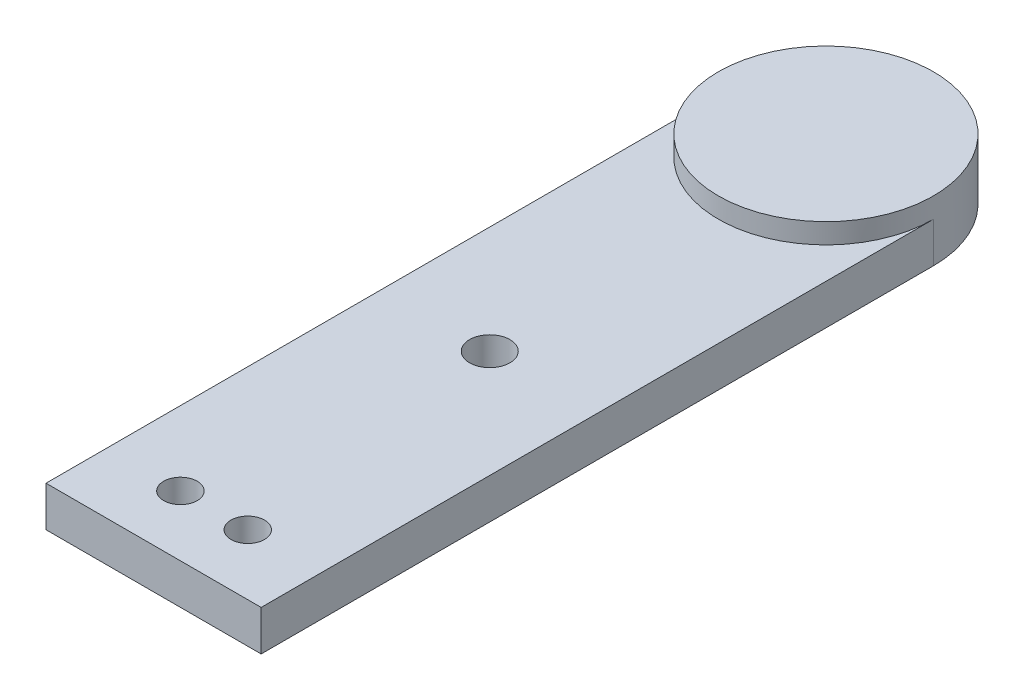
ISO-10303-21;
HEADER;
FILE_DESCRIPTION(('STEP AP214'),'2;1');
FILE_NAME('part.step','',(''),(''),'','','');
FILE_SCHEMA(('AUTOMOTIVE_DESIGN { 1 0 10303 214 1 1 1 1 }'));
ENDSEC;
DATA;
#1=APPLICATION_CONTEXT('core data for automotive mechanical design processes');
#2=APPLICATION_PROTOCOL_DEFINITION('international standard','automotive_design',2000,#1);
#3=PRODUCT_CONTEXT('',#1,'mechanical');
#4=PRODUCT('Part','Part','',(#3));
#5=PRODUCT_RELATED_PRODUCT_CATEGORY('part','',(#4));
#6=PRODUCT_DEFINITION_FORMATION('','',#4);
#7=PRODUCT_DEFINITION_CONTEXT('part definition',#1,'design');
#8=PRODUCT_DEFINITION('design','',#6,#7);
#9=PRODUCT_DEFINITION_SHAPE('','',#8);
#10=(LENGTH_UNIT() NAMED_UNIT(*) SI_UNIT(.MILLI.,.METRE.));
#11=(NAMED_UNIT(*) PLANE_ANGLE_UNIT() SI_UNIT($,.RADIAN.));
#12=(NAMED_UNIT(*) SI_UNIT($,.STERADIAN.) SOLID_ANGLE_UNIT());
#13=UNCERTAINTY_MEASURE_WITH_UNIT(LENGTH_MEASURE(1.E-05),#10,'distance_accuracy_value','');
#14=(GEOMETRIC_REPRESENTATION_CONTEXT(3) GLOBAL_UNCERTAINTY_ASSIGNED_CONTEXT((#13)) GLOBAL_UNIT_ASSIGNED_CONTEXT((#10,
#11,#12)) REPRESENTATION_CONTEXT('',''));
#15=CARTESIAN_POINT('',(0.,0.,0.));
#16=DIRECTION('',(0.,0.,1.));
#17=DIRECTION('',(1.,0.,0.));
#18=AXIS2_PLACEMENT_3D('',#15,#16,#17);
#19=CARTESIAN_POINT('',(0.,3.,0.));
#20=DIRECTION('',(0.,-1.,0.));
#21=DIRECTION('',(0.,0.,-1.));
#22=AXIS2_PLACEMENT_3D('',#19,#20,#21);
#23=CYLINDRICAL_SURFACE('',#22,8.);
#24=CARTESIAN_POINT('',(0.,3.,0.));
#25=DIRECTION('',(0.,1.,0.));
#26=DIRECTION('',(0.,0.,1.));
#27=AXIS2_PLACEMENT_3D('',#24,#25,#26);
#28=CIRCLE('',#27,8.);
#29=CARTESIAN_POINT('',(0.,3.,8.));
#30=VERTEX_POINT('',#29);
#31=EDGE_CURVE('E45',#30,#30,#28,.T.);
#32=ORIENTED_EDGE('',*,*,#31,.F.);
#33=EDGE_LOOP('',(#32));
#34=FACE_BOUND('',#33,.T.);
#35=DIRECTION('',(0.,-1.,0.));
#36=VECTOR('',#35,1.);
#37=CARTESIAN_POINT('',(-8.,1.5,0.));
#38=LINE('',#37,#36);
#39=CARTESIAN_POINT('',(-8.,1.5,0.));
#40=VERTEX_POINT('',#39);
#41=CARTESIAN_POINT('',(-8.,-1.5,0.));
#42=VERTEX_POINT('',#41);
#43=EDGE_CURVE('E55',#40,#42,#38,.T.);
#44=ORIENTED_EDGE('',*,*,#43,.F.);
#45=CARTESIAN_POINT('',(0.,1.5,0.));
#46=DIRECTION('',(0.,1.,0.));
#47=DIRECTION('',(0.,0.,1.));
#48=AXIS2_PLACEMENT_3D('',#45,#46,#47);
#49=CIRCLE('',#48,8.);
#50=CARTESIAN_POINT('',(8.,1.5,0.));
#51=VERTEX_POINT('',#50);
#52=EDGE_CURVE('E11',#40,#51,#49,.T.);
#53=ORIENTED_EDGE('',*,*,#52,.T.);
#54=DIRECTION('',(0.,-1.,0.));
#55=VECTOR('',#54,1.);
#56=CARTESIAN_POINT('',(8.,1.5,0.));
#57=LINE('',#56,#55);
#58=CARTESIAN_POINT('',(8.,-1.5,0.));
#59=VERTEX_POINT('',#58);
#60=EDGE_CURVE('E99',#51,#59,#57,.T.);
#61=ORIENTED_EDGE('',*,*,#60,.T.);
#62=CARTESIAN_POINT('',(0.,-1.5,0.));
#63=DIRECTION('',(0.,1.,0.));
#64=DIRECTION('',(0.,0.,1.));
#65=AXIS2_PLACEMENT_3D('',#62,#63,#64);
#66=CIRCLE('',#65,8.);
#67=EDGE_CURVE('E96',#59,#42,#66,.T.);
#68=ORIENTED_EDGE('',*,*,#67,.T.);
#69=EDGE_LOOP('',(#44,#53,#61,#68));
#70=FACE_BOUND('',#69,.T.);
#71=ADVANCED_FACE('F37',(#34,#70),#23,.T.);
#72=CARTESIAN_POINT('',(0.,3.,0.));
#73=DIRECTION('',(0.,1.,0.));
#74=DIRECTION('',(0.,0.,1.));
#75=AXIS2_PLACEMENT_3D('',#72,#73,#74);
#76=PLANE('',#75);
#77=ORIENTED_EDGE('',*,*,#31,.T.);
#78=EDGE_LOOP('',(#77));
#79=FACE_BOUND('',#78,.T.);
#80=ADVANCED_FACE('F106',(#79),#76,.T.);
#81=CARTESIAN_POINT('',(0.,-1.5,0.));
#82=DIRECTION('',(0.,1.,0.));
#83=DIRECTION('',(0.,0.,1.));
#84=AXIS2_PLACEMENT_3D('',#81,#82,#83);
#85=PLANE('',#84);
#86=CARTESIAN_POINT('',(0.,-1.5,25.));
#87=DIRECTION('',(0.,1.,0.));
#88=DIRECTION('',(0.,0.,1.));
#89=AXIS2_PLACEMENT_3D('',#86,#87,#88);
#90=CIRCLE('',#89,1.5);
#91=CARTESIAN_POINT('',(0.,-1.5,26.5));
#92=VERTEX_POINT('',#91);
#93=EDGE_CURVE('E153',#92,#92,#90,.F.);
#94=ORIENTED_EDGE('',*,*,#93,.F.);
#95=EDGE_LOOP('',(#94));
#96=FACE_BOUND('',#95,.T.);
#97=CARTESIAN_POINT('',(0.,-1.5,0.));
#98=DIRECTION('',(0.,1.,0.));
#99=DIRECTION('',(0.,0.,1.));
#100=AXIS2_PLACEMENT_3D('',#97,#98,#99);
#101=CIRCLE('',#100,3.3);
#102=CARTESIAN_POINT('',(0.,-1.5,3.3));
#103=VERTEX_POINT('',#102);
#104=EDGE_CURVE('E40',#103,#103,#101,.T.);
#105=ORIENTED_EDGE('',*,*,#104,.T.);
#106=EDGE_LOOP('',(#105));
#107=FACE_BOUND('',#106,.T.);
#108=CARTESIAN_POINT('',(-2.50307341777024,-1.5,45.5));
#109=DIRECTION('',(0.,-1.,0.));
#110=DIRECTION('',(0.,0.,-1.));
#111=AXIS2_PLACEMENT_3D('',#108,#109,#110);
#112=CIRCLE('',#111,1.25);
#113=CARTESIAN_POINT('',(-2.50307341777024,-1.5,44.25));
#114=VERTEX_POINT('',#113);
#115=EDGE_CURVE('E159',#114,#114,#112,.T.);
#116=ORIENTED_EDGE('',*,*,#115,.F.);
#117=EDGE_LOOP('',(#116));
#118=FACE_BOUND('',#117,.T.);
#119=CARTESIAN_POINT('',(2.50307341776999,-1.5,45.5));
#120=DIRECTION('',(0.,-1.,0.));
#121=DIRECTION('',(0.,0.,-1.));
#122=AXIS2_PLACEMENT_3D('',#119,#120,#121);
#123=CIRCLE('',#122,1.25);
#124=CARTESIAN_POINT('',(2.50307341776999,-1.5,44.25));
#125=VERTEX_POINT('',#124);
#126=EDGE_CURVE('E156',#125,#125,#123,.T.);
#127=ORIENTED_EDGE('',*,*,#126,.F.);
#128=EDGE_LOOP('',(#127));
#129=FACE_BOUND('',#128,.T.);
#130=ORIENTED_EDGE('',*,*,#67,.F.);
#131=DIRECTION('',(0.,0.,-1.));
#132=VECTOR('',#131,1.);
#133=CARTESIAN_POINT('',(8.,-1.5,0.));
#134=LINE('',#133,#132);
#135=CARTESIAN_POINT('',(8.00000000000001,-1.5,50.));
#136=VERTEX_POINT('',#135);
#137=EDGE_CURVE('E91',#136,#59,#134,.T.);
#138=ORIENTED_EDGE('',*,*,#137,.F.);
#139=DIRECTION('',(1.,0.,0.));
#140=VECTOR('',#139,1.);
#141=CARTESIAN_POINT('',(-8.00000000000001,-1.5,50.));
#142=LINE('',#141,#140);
#143=CARTESIAN_POINT('',(-8.00000000000001,-1.5,50.));
#144=VERTEX_POINT('',#143);
#145=EDGE_CURVE('E172',#144,#136,#142,.T.);
#146=ORIENTED_EDGE('',*,*,#145,.F.);
#147=DIRECTION('',(0.,0.,1.));
#148=VECTOR('',#147,1.);
#149=CARTESIAN_POINT('',(-8.,-1.5,0.));
#150=LINE('',#149,#148);
#151=EDGE_CURVE('E95',#42,#144,#150,.T.);
#152=ORIENTED_EDGE('',*,*,#151,.F.);
#153=EDGE_LOOP('',(#130,#138,#146,#152));
#154=FACE_BOUND('',#153,.T.);
#155=ADVANCED_FACE('F112',(#96,#107,#118,#129,#154),#85,.F.);
#156=CARTESIAN_POINT('',(-8.,1.5,0.));
#157=DIRECTION('',(1.,0.,0.));
#158=DIRECTION('',(0.,0.,-1.));
#159=AXIS2_PLACEMENT_3D('',#156,#157,#158);
#160=PLANE('',#159);
#161=ORIENTED_EDGE('',*,*,#151,.T.);
#162=DIRECTION('',(0.,-1.,0.));
#163=VECTOR('',#162,1.);
#164=CARTESIAN_POINT('',(-8.00000000000001,1.5,50.));
#165=LINE('',#164,#163);
#166=CARTESIAN_POINT('',(-8.00000000000001,1.5,50.));
#167=VERTEX_POINT('',#166);
#168=EDGE_CURVE('E79',#167,#144,#165,.T.);
#169=ORIENTED_EDGE('',*,*,#168,.F.);
#170=DIRECTION('',(0.,0.,1.));
#171=VECTOR('',#170,1.);
#172=CARTESIAN_POINT('',(-8.,1.5,0.));
#173=LINE('',#172,#171);
#174=EDGE_CURVE('E86',#40,#167,#173,.T.);
#175=ORIENTED_EDGE('',*,*,#174,.F.);
#176=ORIENTED_EDGE('',*,*,#43,.T.);
#177=EDGE_LOOP('',(#161,#169,#175,#176));
#178=FACE_BOUND('',#177,.T.);
#179=ADVANCED_FACE('F93',(#178),#160,.F.);
#180=CARTESIAN_POINT('',(-8.00000000000001,1.5,50.));
#181=DIRECTION('',(0.,0.,-1.));
#182=DIRECTION('',(-1.,0.,0.));
#183=AXIS2_PLACEMENT_3D('',#180,#181,#182);
#184=PLANE('',#183);
#185=ORIENTED_EDGE('',*,*,#145,.T.);
#186=DIRECTION('',(0.,-1.,0.));
#187=VECTOR('',#186,1.);
#188=CARTESIAN_POINT('',(8.00000000000001,1.5,50.));
#189=LINE('',#188,#187);
#190=CARTESIAN_POINT('',(8.00000000000001,1.5,50.));
#191=VERTEX_POINT('',#190);
#192=EDGE_CURVE('E82',#191,#136,#189,.T.);
#193=ORIENTED_EDGE('',*,*,#192,.F.);
#194=DIRECTION('',(1.,0.,0.));
#195=VECTOR('',#194,1.);
#196=CARTESIAN_POINT('',(-8.00000000000001,1.5,50.));
#197=LINE('',#196,#195);
#198=EDGE_CURVE('E75',#167,#191,#197,.T.);
#199=ORIENTED_EDGE('',*,*,#198,.F.);
#200=ORIENTED_EDGE('',*,*,#168,.T.);
#201=EDGE_LOOP('',(#185,#193,#199,#200));
#202=FACE_BOUND('',#201,.T.);
#203=ADVANCED_FACE('F77',(#202),#184,.F.);
#204=CARTESIAN_POINT('',(8.,1.5,0.));
#205=DIRECTION('',(-1.,0.,0.));
#206=DIRECTION('',(0.,0.,1.));
#207=AXIS2_PLACEMENT_3D('',#204,#205,#206);
#208=PLANE('',#207);
#209=ORIENTED_EDGE('',*,*,#137,.T.);
#210=ORIENTED_EDGE('',*,*,#60,.F.);
#211=DIRECTION('',(0.,0.,-1.));
#212=VECTOR('',#211,1.);
#213=CARTESIAN_POINT('',(8.,1.5,0.));
#214=LINE('',#213,#212);
#215=EDGE_CURVE('E85',#191,#51,#214,.T.);
#216=ORIENTED_EDGE('',*,*,#215,.F.);
#217=ORIENTED_EDGE('',*,*,#192,.T.);
#218=EDGE_LOOP('',(#209,#210,#216,#217));
#219=FACE_BOUND('',#218,.T.);
#220=ADVANCED_FACE('F123',(#219),#208,.F.);
#221=CARTESIAN_POINT('',(0.,1.5,0.));
#222=DIRECTION('',(0.,1.,0.));
#223=DIRECTION('',(0.,0.,1.));
#224=AXIS2_PLACEMENT_3D('',#221,#222,#223);
#225=PLANE('',#224);
#226=CARTESIAN_POINT('',(0.,1.5,25.));
#227=DIRECTION('',(0.,1.,0.));
#228=DIRECTION('',(0.,0.,1.));
#229=AXIS2_PLACEMENT_3D('',#226,#227,#228);
#230=CIRCLE('',#229,1.5);
#231=CARTESIAN_POINT('',(0.,1.5,26.5));
#232=VERTEX_POINT('',#231);
#233=EDGE_CURVE('E150',#232,#232,#230,.T.);
#234=ORIENTED_EDGE('',*,*,#233,.F.);
#235=EDGE_LOOP('',(#234));
#236=FACE_BOUND('',#235,.T.);
#237=CARTESIAN_POINT('',(-2.50307341777024,1.5,45.5));
#238=DIRECTION('',(0.,1.,0.));
#239=DIRECTION('',(0.,0.,1.));
#240=AXIS2_PLACEMENT_3D('',#237,#238,#239);
#241=CIRCLE('',#240,1.25);
#242=CARTESIAN_POINT('',(-2.50307341777024,1.5,46.75));
#243=VERTEX_POINT('',#242);
#244=EDGE_CURVE('E162',#243,#243,#241,.F.);
#245=ORIENTED_EDGE('',*,*,#244,.T.);
#246=EDGE_LOOP('',(#245));
#247=FACE_BOUND('',#246,.T.);
#248=CARTESIAN_POINT('',(2.50307341776999,1.5,45.5));
#249=DIRECTION('',(0.,1.,0.));
#250=DIRECTION('',(0.,0.,1.));
#251=AXIS2_PLACEMENT_3D('',#248,#249,#250);
#252=CIRCLE('',#251,1.25);
#253=CARTESIAN_POINT('',(2.50307341776999,1.5,46.75));
#254=VERTEX_POINT('',#253);
#255=EDGE_CURVE('E165',#254,#254,#252,.F.);
#256=ORIENTED_EDGE('',*,*,#255,.T.);
#257=EDGE_LOOP('',(#256));
#258=FACE_BOUND('',#257,.T.);
#259=ORIENTED_EDGE('',*,*,#52,.F.);
#260=ORIENTED_EDGE('',*,*,#174,.T.);
#261=ORIENTED_EDGE('',*,*,#198,.T.);
#262=ORIENTED_EDGE('',*,*,#215,.T.);
#263=EDGE_LOOP('',(#259,#260,#261,#262));
#264=FACE_BOUND('',#263,.T.);
#265=ADVANCED_FACE('F89',(#236,#247,#258,#264),#225,.T.);
#266=CARTESIAN_POINT('',(2.50307341776999,3.001,45.5));
#267=DIRECTION('',(0.,-1.,0.));
#268=DIRECTION('',(0.,0.,-1.));
#269=AXIS2_PLACEMENT_3D('',#266,#267,#268);
#270=CYLINDRICAL_SURFACE('',#269,1.25);
#271=ORIENTED_EDGE('',*,*,#255,.F.);
#272=EDGE_LOOP('',(#271));
#273=FACE_BOUND('',#272,.T.);
#274=ORIENTED_EDGE('',*,*,#126,.T.);
#275=EDGE_LOOP('',(#274));
#276=FACE_BOUND('',#275,.T.);
#277=ADVANCED_FACE('F129',(#273,#276),#270,.F.);
#278=CARTESIAN_POINT('',(-2.50307341777024,3.001,45.5));
#279=DIRECTION('',(0.,-1.,0.));
#280=DIRECTION('',(0.,0.,-1.));
#281=AXIS2_PLACEMENT_3D('',#278,#279,#280);
#282=CYLINDRICAL_SURFACE('',#281,1.25);
#283=ORIENTED_EDGE('',*,*,#244,.F.);
#284=EDGE_LOOP('',(#283));
#285=FACE_BOUND('',#284,.T.);
#286=ORIENTED_EDGE('',*,*,#115,.T.);
#287=EDGE_LOOP('',(#286));
#288=FACE_BOUND('',#287,.T.);
#289=ADVANCED_FACE('F133',(#285,#288),#282,.F.);
#290=CARTESIAN_POINT('',(0.,-1.5,0.));
#291=DIRECTION('',(1.,0.,0.));
#292=DIRECTION('',(0.,0.,-1.));
#293=AXIS2_PLACEMENT_3D('',#290,#291,#292);
#294=SPHERICAL_SURFACE('',#293,3.3);
#295=CARTESIAN_POINT('',(0.,-1.5,0.));
#296=DIRECTION('',(0.,1.,0.));
#297=DIRECTION('',(0.,0.,1.));
#298=AXIS2_PLACEMENT_3D('',#295,#296,#297);
#299=SPHERICAL_SURFACE('',#298,3.3);
#300=ORIENTED_EDGE('',*,*,#104,.F.);
#301=EDGE_LOOP('',(#300));
#302=FACE_BOUND('',#301,.T.);
#303=ADVANCED_FACE('F137',(#302),#299,.F.);
#304=CARTESIAN_POINT('',(0.,-1.501,25.));
#305=DIRECTION('',(0.,1.,0.));
#306=DIRECTION('',(0.,0.,1.));
#307=AXIS2_PLACEMENT_3D('',#304,#305,#306);
#308=CYLINDRICAL_SURFACE('',#307,1.5);
#309=CARTESIAN_POINT('',(0.,1.5,26.5));
#310=CARTESIAN_POINT('',(0.,1.46875,26.5));
#311=CARTESIAN_POINT('',(0.,1.4375,26.5));
#312=CARTESIAN_POINT('',(0.,1.375,26.5));
#313=CARTESIAN_POINT('',(0.,1.34375,26.5));
#314=CARTESIAN_POINT('',(0.,1.28125,26.5));
#315=CARTESIAN_POINT('',(0.,1.25,26.5));
#316=CARTESIAN_POINT('',(0.,1.1875,26.5));
#317=CARTESIAN_POINT('',(0.,1.15625,26.5));
#318=CARTESIAN_POINT('',(0.,1.09375,26.5));
#319=CARTESIAN_POINT('',(0.,1.0625,26.5));
#320=CARTESIAN_POINT('',(0.,1.,26.5));
#321=CARTESIAN_POINT('',(0.,0.96875,26.5));
#322=CARTESIAN_POINT('',(0.,0.90625,26.5));
#323=CARTESIAN_POINT('',(0.,0.874999999999999,26.5));
#324=CARTESIAN_POINT('',(0.,0.8125,26.5));
#325=CARTESIAN_POINT('',(0.,0.78125,26.5));
#326=CARTESIAN_POINT('',(0.,0.71875,26.5));
#327=CARTESIAN_POINT('',(0.,0.6875,26.5));
#328=CARTESIAN_POINT('',(0.,0.625,26.5));
#329=CARTESIAN_POINT('',(0.,0.59375,26.5));
#330=CARTESIAN_POINT('',(0.,0.53125,26.5));
#331=CARTESIAN_POINT('',(0.,0.5,26.5));
#332=CARTESIAN_POINT('',(0.,0.4375,26.5));
#333=CARTESIAN_POINT('',(0.,0.40625,26.5));
#334=CARTESIAN_POINT('',(0.,0.34375,26.5));
#335=CARTESIAN_POINT('',(0.,0.3125,26.5));
#336=CARTESIAN_POINT('',(0.,0.25,26.5));
#337=CARTESIAN_POINT('',(0.,0.21875,26.5));
#338=CARTESIAN_POINT('',(0.,0.15625,26.5));
#339=CARTESIAN_POINT('',(0.,0.125,26.5));
#340=CARTESIAN_POINT('',(0.,0.0624999999999998,26.5));
#341=CARTESIAN_POINT('',(0.,0.0312499999999998,26.5));
#342=CARTESIAN_POINT('',(0.,-0.0312500000000002,26.5));
#343=CARTESIAN_POINT('',(0.,-0.0625000000000003,26.5));
#344=CARTESIAN_POINT('',(0.,-0.125,26.5));
#345=CARTESIAN_POINT('',(0.,-0.15625,26.5));
#346=CARTESIAN_POINT('',(0.,-0.21875,26.5));
#347=CARTESIAN_POINT('',(0.,-0.25,26.5));
#348=CARTESIAN_POINT('',(0.,-0.3125,26.5));
#349=CARTESIAN_POINT('',(0.,-0.34375,26.5));
#350=CARTESIAN_POINT('',(0.,-0.40625,26.5));
#351=CARTESIAN_POINT('',(0.,-0.4375,26.5));
#352=CARTESIAN_POINT('',(0.,-0.5,26.5));
#353=CARTESIAN_POINT('',(0.,-0.53125,26.5));
#354=CARTESIAN_POINT('',(0.,-0.59375,26.5));
#355=CARTESIAN_POINT('',(0.,-0.625,26.5));
#356=CARTESIAN_POINT('',(0.,-0.6875,26.5));
#357=CARTESIAN_POINT('',(0.,-0.71875,26.5));
#358=CARTESIAN_POINT('',(0.,-0.78125,26.5));
#359=CARTESIAN_POINT('',(0.,-0.8125,26.5));
#360=CARTESIAN_POINT('',(0.,-0.875,26.5));
#361=CARTESIAN_POINT('',(0.,-0.90625,26.5));
#362=CARTESIAN_POINT('',(0.,-0.96875,26.5));
#363=CARTESIAN_POINT('',(0.,-1.,26.5));
#364=CARTESIAN_POINT('',(0.,-1.0625,26.5));
#365=CARTESIAN_POINT('',(0.,-1.09375,26.5));
#366=CARTESIAN_POINT('',(0.,-1.15625,26.5));
#367=CARTESIAN_POINT('',(0.,-1.1875,26.5));
#368=CARTESIAN_POINT('',(0.,-1.25,26.5));
#369=CARTESIAN_POINT('',(0.,-1.28125,26.5));
#370=CARTESIAN_POINT('',(0.,-1.34375,26.5));
#371=CARTESIAN_POINT('',(0.,-1.375,26.5));
#372=CARTESIAN_POINT('',(0.,-1.4375,26.5));
#373=CARTESIAN_POINT('',(0.,-1.46875,26.5));
#374=CARTESIAN_POINT('',(0.,-1.5,26.5));
#375=B_SPLINE_CURVE_WITH_KNOTS('',3,(#309,#310,#311,#312,#313,#314,#315,#316,#317,#318,#319,
#320,#321,#322,#323,#324,#325,#326,#327,#328,#329,#330,#331,#332,#333,#334,#335,#336,#337,#338,
#339,#340,#341,#342,#343,#344,#345,#346,#347,#348,#349,#350,#351,#352,#353,#354,#355,#356,#357,
#358,#359,#360,#361,#362,#363,#364,#365,#366,#367,#368,#369,#370,#371,#372,#373,#374),
.UNSPECIFIED.,.F.,.F.,(4,2,2,2,2,2,2,2,2,2,2,2,2,2,2,2,2,2,2,2,2,2,2,2,2,2,2,2,2,2,2,2,4),(0.,
0.0937500000000001,0.1875,0.28125,0.375,0.46875,0.5625,0.65625,0.75,0.84375,0.9375,1.03125,
1.125,1.21875,1.3125,1.40625,1.5,1.59375,1.6875,1.78125,1.875,1.96875,2.0625,2.15625,2.25,
2.34375,2.4375,2.53125,2.625,2.71875,2.8125,2.90625,3.),.UNSPECIFIED.);
#376=EDGE_CURVE('BSEAM141',#232,#92,#375,.T.);
#377=ORIENTED_EDGE('',*,*,#233,.T.);
#378=ORIENTED_EDGE('',*,*,#93,.T.);
#379=ORIENTED_EDGE('',*,*,#376,.T.);
#380=ORIENTED_EDGE('',*,*,#376,.F.);
#381=EDGE_LOOP('',(#377,#379,#378,#380));
#382=FACE_BOUND('',#381,.T.);
#383=ADVANCED_FACE('F141',(#382),#308,.F.);
#384=CLOSED_SHELL('',(#71,#80,#155,#179,#203,#220,#265,#277,#289,#303,#383));
#385=MANIFOLD_SOLID_BREP('B2',#384);
#386=ADVANCED_BREP_SHAPE_REPRESENTATION('',(#18,#385),#14);
#387=SHAPE_DEFINITION_REPRESENTATION(#9,#386);
ENDSEC;
END-ISO-10303-21;
